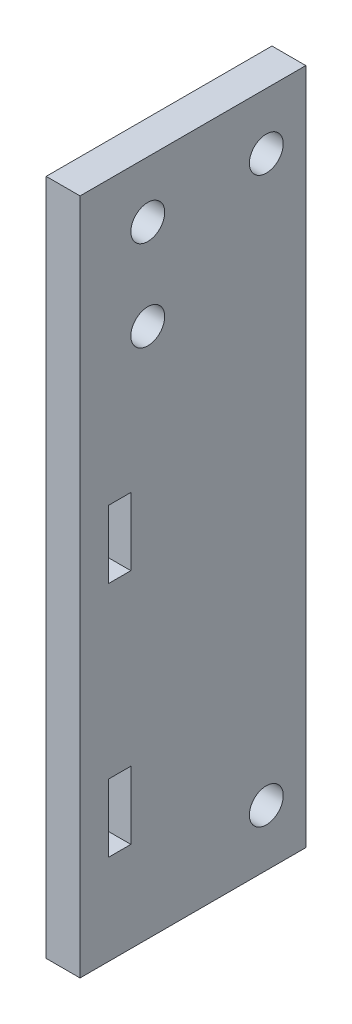
ISO-10303-21;
HEADER;
FILE_DESCRIPTION(('STEP AP214'),'2;1');
FILE_NAME('part.step','',(''),(''),'','','');
FILE_SCHEMA(('AUTOMOTIVE_DESIGN { 1 0 10303 214 1 1 1 1 }'));
ENDSEC;
DATA;
#1=APPLICATION_CONTEXT('core data for automotive mechanical design processes');
#2=APPLICATION_PROTOCOL_DEFINITION('international standard','automotive_design',2000,#1);
#3=PRODUCT_CONTEXT('',#1,'mechanical');
#4=PRODUCT('Part','Part','',(#3));
#5=PRODUCT_RELATED_PRODUCT_CATEGORY('part','',(#4));
#6=PRODUCT_DEFINITION_FORMATION('','',#4);
#7=PRODUCT_DEFINITION_CONTEXT('part definition',#1,'design');
#8=PRODUCT_DEFINITION('design','',#6,#7);
#9=PRODUCT_DEFINITION_SHAPE('','',#8);
#10=(LENGTH_UNIT() NAMED_UNIT(*) SI_UNIT(.MILLI.,.METRE.));
#11=(NAMED_UNIT(*) PLANE_ANGLE_UNIT() SI_UNIT($,.RADIAN.));
#12=(NAMED_UNIT(*) SI_UNIT($,.STERADIAN.) SOLID_ANGLE_UNIT());
#13=UNCERTAINTY_MEASURE_WITH_UNIT(LENGTH_MEASURE(1.E-05),#10,'distance_accuracy_value','');
#14=(GEOMETRIC_REPRESENTATION_CONTEXT(3) GLOBAL_UNCERTAINTY_ASSIGNED_CONTEXT((#13)) GLOBAL_UNIT_ASSIGNED_CONTEXT((#10,
#11,#12)) REPRESENTATION_CONTEXT('',''));
#15=CARTESIAN_POINT('',(0.,0.,0.));
#16=DIRECTION('',(0.,0.,1.));
#17=DIRECTION('',(1.,0.,0.));
#18=AXIS2_PLACEMENT_3D('',#15,#16,#17);
#19=CARTESIAN_POINT('',(0.,50.118347710839,69.8641041332545));
#20=DIRECTION('',(0.,1.,0.));
#21=DIRECTION('',(1.,0.,0.));
#22=AXIS2_PLACEMENT_3D('',#19,#20,#21);
#23=PLANE('',#22);
#24=DIRECTION('',(0.,0.,1.));
#25=VECTOR('',#24,1.);
#26=CARTESIAN_POINT('',(0.,50.118347710839,69.8641041332545));
#27=LINE('',#26,#25);
#28=CARTESIAN_POINT('',(0.,50.118347710839,69.8641041332545));
#29=VERTEX_POINT('',#28);
#30=CARTESIAN_POINT('',(0.,50.118347710839,89.8641041332545));
#31=VERTEX_POINT('',#30);
#32=EDGE_CURVE('E254',#29,#31,#27,.T.);
#33=ORIENTED_EDGE('',*,*,#32,.T.);
#34=DIRECTION('',(1.,0.,0.));
#35=VECTOR('',#34,1.);
#36=CARTESIAN_POINT('',(0.,50.118347710839,89.8641041332545));
#37=LINE('',#36,#35);
#38=CARTESIAN_POINT('',(3.,50.118347710839,89.8641041332545));
#39=VERTEX_POINT('',#38);
#40=EDGE_CURVE('E10',#31,#39,#37,.T.);
#41=ORIENTED_EDGE('',*,*,#40,.T.);
#42=DIRECTION('',(0.,0.,1.));
#43=VECTOR('',#42,1.);
#44=CARTESIAN_POINT('',(3.,50.118347710839,69.8641041332545));
#45=LINE('',#44,#43);
#46=CARTESIAN_POINT('',(3.,50.118347710839,69.8641041332545));
#47=VERTEX_POINT('',#46);
#48=EDGE_CURVE('E240',#47,#39,#45,.T.);
#49=ORIENTED_EDGE('',*,*,#48,.F.);
#50=DIRECTION('',(1.,0.,0.));
#51=VECTOR('',#50,1.);
#52=CARTESIAN_POINT('',(0.,50.118347710839,69.8641041332545));
#53=LINE('',#52,#51);
#54=EDGE_CURVE('E150',#29,#47,#53,.T.);
#55=ORIENTED_EDGE('',*,*,#54,.F.);
#56=EDGE_LOOP('',(#33,#41,#49,#55));
#57=FACE_BOUND('',#56,.T.);
#58=ADVANCED_FACE('F15',(#57),#23,.T.);
#59=CARTESIAN_POINT('',(0.,50.118347710839,89.8641041332545));
#60=DIRECTION('',(0.,0.,1.));
#61=DIRECTION('',(1.,0.,0.));
#62=AXIS2_PLACEMENT_3D('',#59,#60,#61);
#63=PLANE('',#62);
#64=DIRECTION('',(0.,-1.,0.));
#65=VECTOR('',#64,1.);
#66=CARTESIAN_POINT('',(0.,50.118347710839,89.8641041332545));
#67=LINE('',#66,#65);
#68=CARTESIAN_POINT('',(0.,-9.88165228916096,89.8641041332545));
#69=VERTEX_POINT('',#68);
#70=EDGE_CURVE('E259',#31,#69,#67,.T.);
#71=ORIENTED_EDGE('',*,*,#70,.T.);
#72=DIRECTION('',(1.,0.,0.));
#73=VECTOR('',#72,1.);
#74=CARTESIAN_POINT('',(0.,-9.88165228916096,89.8641041332545));
#75=LINE('',#74,#73);
#76=CARTESIAN_POINT('',(3.,-9.88165228916096,89.8641041332545));
#77=VERTEX_POINT('',#76);
#78=EDGE_CURVE('E26',#69,#77,#75,.T.);
#79=ORIENTED_EDGE('',*,*,#78,.T.);
#80=DIRECTION('',(0.,-1.,0.));
#81=VECTOR('',#80,1.);
#82=CARTESIAN_POINT('',(3.,50.118347710839,89.8641041332545));
#83=LINE('',#82,#81);
#84=EDGE_CURVE('E270',#39,#77,#83,.T.);
#85=ORIENTED_EDGE('',*,*,#84,.F.);
#86=ORIENTED_EDGE('',*,*,#40,.F.);
#87=EDGE_LOOP('',(#71,#79,#85,#86));
#88=FACE_BOUND('',#87,.T.);
#89=ADVANCED_FACE('F353',(#88),#63,.T.);
#90=CARTESIAN_POINT('',(0.,-9.88165228916096,89.8641041332545));
#91=DIRECTION('',(0.,-1.,0.));
#92=DIRECTION('',(0.,0.,-1.));
#93=AXIS2_PLACEMENT_3D('',#90,#91,#92);
#94=PLANE('',#93);
#95=DIRECTION('',(0.,0.,-1.));
#96=VECTOR('',#95,1.);
#97=CARTESIAN_POINT('',(0.,-9.88165228916096,89.8641041332545));
#98=LINE('',#97,#96);
#99=CARTESIAN_POINT('',(0.,-9.88165228916096,69.8641041332545));
#100=VERTEX_POINT('',#99);
#101=EDGE_CURVE('E237',#69,#100,#98,.T.);
#102=ORIENTED_EDGE('',*,*,#101,.T.);
#103=DIRECTION('',(1.,0.,0.));
#104=VECTOR('',#103,1.);
#105=CARTESIAN_POINT('',(0.,-9.88165228916096,69.8641041332545));
#106=LINE('',#105,#104);
#107=CARTESIAN_POINT('',(3.,-9.88165228916096,69.8641041332545));
#108=VERTEX_POINT('',#107);
#109=EDGE_CURVE('E172',#100,#108,#106,.T.);
#110=ORIENTED_EDGE('',*,*,#109,.T.);
#111=DIRECTION('',(0.,0.,-1.));
#112=VECTOR('',#111,1.);
#113=CARTESIAN_POINT('',(3.,-9.88165228916096,89.8641041332545));
#114=LINE('',#113,#112);
#115=EDGE_CURVE('E263',#77,#108,#114,.T.);
#116=ORIENTED_EDGE('',*,*,#115,.F.);
#117=ORIENTED_EDGE('',*,*,#78,.F.);
#118=EDGE_LOOP('',(#102,#110,#116,#117));
#119=FACE_BOUND('',#118,.T.);
#120=ADVANCED_FACE('F359',(#119),#94,.T.);
#121=CARTESIAN_POINT('',(0.,-9.88165228916096,69.8641041332545));
#122=DIRECTION('',(0.,0.,-1.));
#123=DIRECTION('',(0.,-1.,0.));
#124=AXIS2_PLACEMENT_3D('',#121,#122,#123);
#125=PLANE('',#124);
#126=DIRECTION('',(0.,1.,0.));
#127=VECTOR('',#126,1.);
#128=CARTESIAN_POINT('',(0.,-9.88165228916096,69.8641041332545));
#129=LINE('',#128,#127);
#130=EDGE_CURVE('E234',#100,#29,#129,.T.);
#131=ORIENTED_EDGE('',*,*,#130,.T.);
#132=ORIENTED_EDGE('',*,*,#54,.T.);
#133=DIRECTION('',(0.,1.,0.));
#134=VECTOR('',#133,1.);
#135=CARTESIAN_POINT('',(3.,-9.88165228916096,69.8641041332545));
#136=LINE('',#135,#134);
#137=EDGE_CURVE('E260',#108,#47,#136,.T.);
#138=ORIENTED_EDGE('',*,*,#137,.F.);
#139=ORIENTED_EDGE('',*,*,#109,.F.);
#140=EDGE_LOOP('',(#131,#132,#138,#139));
#141=FACE_BOUND('',#140,.T.);
#142=ADVANCED_FACE('F379',(#141),#125,.T.);
#143=CARTESIAN_POINT('',(0.,4.11834771083904,87.3641041332545));
#144=DIRECTION('',(0.,0.,1.));
#145=DIRECTION('',(1.,0.,0.));
#146=AXIS2_PLACEMENT_3D('',#143,#144,#145);
#147=PLANE('',#146);
#148=DIRECTION('',(0.,1.,0.));
#149=VECTOR('',#148,1.);
#150=CARTESIAN_POINT('',(3.,4.11834771083904,87.3641041332545));
#151=LINE('',#150,#149);
#152=CARTESIAN_POINT('',(3.,-1.88165228916096,87.3641041332545));
#153=VERTEX_POINT('',#152);
#154=CARTESIAN_POINT('',(3.,4.11834771083904,87.3641041332545));
#155=VERTEX_POINT('',#154);
#156=EDGE_CURVE('E19',#153,#155,#151,.T.);
#157=ORIENTED_EDGE('',*,*,#156,.F.);
#158=DIRECTION('',(1.,0.,0.));
#159=VECTOR('',#158,1.);
#160=CARTESIAN_POINT('',(0.,-1.88165228916096,87.3641041332545));
#161=LINE('',#160,#159);
#162=CARTESIAN_POINT('',(0.,-1.88165228916096,87.3641041332545));
#163=VERTEX_POINT('',#162);
#164=EDGE_CURVE('E86',#163,#153,#161,.T.);
#165=ORIENTED_EDGE('',*,*,#164,.F.);
#166=DIRECTION('',(0.,-1.,0.));
#167=VECTOR('',#166,1.);
#168=CARTESIAN_POINT('',(0.,4.11834771083904,87.3641041332545));
#169=LINE('',#168,#167);
#170=CARTESIAN_POINT('',(0.,4.11834771083904,87.3641041332545));
#171=VERTEX_POINT('',#170);
#172=EDGE_CURVE('E258',#171,#163,#169,.T.);
#173=ORIENTED_EDGE('',*,*,#172,.F.);
#174=DIRECTION('',(1.,0.,0.));
#175=VECTOR('',#174,1.);
#176=CARTESIAN_POINT('',(0.,4.11834771083904,87.3641041332545));
#177=LINE('',#176,#175);
#178=EDGE_CURVE('E299',#171,#155,#177,.T.);
#179=ORIENTED_EDGE('',*,*,#178,.T.);
#180=EDGE_LOOP('',(#157,#165,#173,#179));
#181=FACE_BOUND('',#180,.T.);
#182=ADVANCED_FACE('F374',(#181),#147,.F.);
#183=CARTESIAN_POINT('',(0.,-1.88165228916096,87.3641041332545));
#184=DIRECTION('',(0.,-1.,0.));
#185=DIRECTION('',(0.,0.,-1.));
#186=AXIS2_PLACEMENT_3D('',#183,#184,#185);
#187=PLANE('',#186);
#188=DIRECTION('',(0.,0.,1.));
#189=VECTOR('',#188,1.);
#190=CARTESIAN_POINT('',(3.,-1.88165228916096,87.3641041332545));
#191=LINE('',#190,#189);
#192=CARTESIAN_POINT('',(3.,-1.88165228916096,85.3641041332545));
#193=VERTEX_POINT('',#192);
#194=EDGE_CURVE('E323',#193,#153,#191,.T.);
#195=ORIENTED_EDGE('',*,*,#194,.F.);
#196=DIRECTION('',(1.,0.,0.));
#197=VECTOR('',#196,1.);
#198=CARTESIAN_POINT('',(0.,-1.88165228916096,85.3641041332545));
#199=LINE('',#198,#197);
#200=CARTESIAN_POINT('',(0.,-1.88165228916096,85.3641041332545));
#201=VERTEX_POINT('',#200);
#202=EDGE_CURVE('E70',#201,#193,#199,.T.);
#203=ORIENTED_EDGE('',*,*,#202,.F.);
#204=DIRECTION('',(0.,0.,-1.));
#205=VECTOR('',#204,1.);
#206=CARTESIAN_POINT('',(0.,-1.88165228916096,87.3641041332545));
#207=LINE('',#206,#205);
#208=EDGE_CURVE('E233',#163,#201,#207,.T.);
#209=ORIENTED_EDGE('',*,*,#208,.F.);
#210=ORIENTED_EDGE('',*,*,#164,.T.);
#211=EDGE_LOOP('',(#195,#203,#209,#210));
#212=FACE_BOUND('',#211,.T.);
#213=ADVANCED_FACE('F370',(#212),#187,.F.);
#214=CARTESIAN_POINT('',(0.,-1.88165228916096,85.3641041332545));
#215=DIRECTION('',(0.,0.,-1.));
#216=DIRECTION('',(0.,-1.,0.));
#217=AXIS2_PLACEMENT_3D('',#214,#215,#216);
#218=PLANE('',#217);
#219=DIRECTION('',(0.,-1.,0.));
#220=VECTOR('',#219,1.);
#221=CARTESIAN_POINT('',(3.,-1.88165228916096,85.3641041332545));
#222=LINE('',#221,#220);
#223=CARTESIAN_POINT('',(3.,4.11834771083904,85.3641041332545));
#224=VERTEX_POINT('',#223);
#225=EDGE_CURVE('E291',#224,#193,#222,.T.);
#226=ORIENTED_EDGE('',*,*,#225,.F.);
#227=DIRECTION('',(1.,0.,0.));
#228=VECTOR('',#227,1.);
#229=CARTESIAN_POINT('',(0.,4.11834771083904,85.3641041332545));
#230=LINE('',#229,#228);
#231=CARTESIAN_POINT('',(0.,4.11834771083904,85.3641041332545));
#232=VERTEX_POINT('',#231);
#233=EDGE_CURVE('E247',#232,#224,#230,.T.);
#234=ORIENTED_EDGE('',*,*,#233,.F.);
#235=DIRECTION('',(0.,1.,0.));
#236=VECTOR('',#235,1.);
#237=CARTESIAN_POINT('',(0.,-1.88165228916096,85.3641041332545));
#238=LINE('',#237,#236);
#239=EDGE_CURVE('E229',#201,#232,#238,.T.);
#240=ORIENTED_EDGE('',*,*,#239,.F.);
#241=ORIENTED_EDGE('',*,*,#202,.T.);
#242=EDGE_LOOP('',(#226,#234,#240,#241));
#243=FACE_BOUND('',#242,.T.);
#244=ADVANCED_FACE('F366',(#243),#218,.F.);
#245=CARTESIAN_POINT('',(0.,4.11834771083904,85.3641041332545));
#246=DIRECTION('',(0.,1.,0.));
#247=DIRECTION('',(1.,0.,0.));
#248=AXIS2_PLACEMENT_3D('',#245,#246,#247);
#249=PLANE('',#248);
#250=DIRECTION('',(0.,0.,-1.));
#251=VECTOR('',#250,1.);
#252=CARTESIAN_POINT('',(3.,4.11834771083904,85.3641041332545));
#253=LINE('',#252,#251);
#254=EDGE_CURVE('E287',#155,#224,#253,.T.);
#255=ORIENTED_EDGE('',*,*,#254,.F.);
#256=ORIENTED_EDGE('',*,*,#178,.F.);
#257=DIRECTION('',(0.,0.,1.));
#258=VECTOR('',#257,1.);
#259=CARTESIAN_POINT('',(0.,4.11834771083904,85.3641041332545));
#260=LINE('',#259,#258);
#261=EDGE_CURVE('E224',#232,#171,#260,.T.);
#262=ORIENTED_EDGE('',*,*,#261,.F.);
#263=ORIENTED_EDGE('',*,*,#233,.T.);
#264=EDGE_LOOP('',(#255,#256,#262,#263));
#265=FACE_BOUND('',#264,.T.);
#266=ADVANCED_FACE('F369',(#265),#249,.F.);
#267=CARTESIAN_POINT('',(0.,25.118347710839,87.3641041332545));
#268=DIRECTION('',(0.,0.,1.));
#269=DIRECTION('',(1.,0.,0.));
#270=AXIS2_PLACEMENT_3D('',#267,#268,#269);
#271=PLANE('',#270);
#272=DIRECTION('',(0.,1.,0.));
#273=VECTOR('',#272,1.);
#274=CARTESIAN_POINT('',(3.,25.118347710839,87.3641041332545));
#275=LINE('',#274,#273);
#276=CARTESIAN_POINT('',(3.,19.118347710839,87.3641041332545));
#277=VERTEX_POINT('',#276);
#278=CARTESIAN_POINT('',(3.,25.118347710839,87.3641041332545));
#279=VERTEX_POINT('',#278);
#280=EDGE_CURVE('E252',#277,#279,#275,.T.);
#281=ORIENTED_EDGE('',*,*,#280,.F.);
#282=DIRECTION('',(1.,0.,0.));
#283=VECTOR('',#282,1.);
#284=CARTESIAN_POINT('',(0.,19.118347710839,87.3641041332545));
#285=LINE('',#284,#283);
#286=CARTESIAN_POINT('',(0.,19.118347710839,87.3641041332545));
#287=VERTEX_POINT('',#286);
#288=EDGE_CURVE('E186',#287,#277,#285,.T.);
#289=ORIENTED_EDGE('',*,*,#288,.F.);
#290=DIRECTION('',(0.,-1.,0.));
#291=VECTOR('',#290,1.);
#292=CARTESIAN_POINT('',(0.,25.118347710839,87.3641041332545));
#293=LINE('',#292,#291);
#294=CARTESIAN_POINT('',(0.,25.118347710839,87.3641041332545));
#295=VERTEX_POINT('',#294);
#296=EDGE_CURVE('E217',#295,#287,#293,.T.);
#297=ORIENTED_EDGE('',*,*,#296,.F.);
#298=DIRECTION('',(1.,0.,0.));
#299=VECTOR('',#298,1.);
#300=CARTESIAN_POINT('',(0.,25.118347710839,87.3641041332545));
#301=LINE('',#300,#299);
#302=EDGE_CURVE('E244',#295,#279,#301,.T.);
#303=ORIENTED_EDGE('',*,*,#302,.T.);
#304=EDGE_LOOP('',(#281,#289,#297,#303));
#305=FACE_BOUND('',#304,.T.);
#306=ADVANCED_FACE('F382',(#305),#271,.F.);
#307=CARTESIAN_POINT('',(0.,19.118347710839,87.3641041332545));
#308=DIRECTION('',(0.,-1.,0.));
#309=DIRECTION('',(0.,0.,-1.));
#310=AXIS2_PLACEMENT_3D('',#307,#308,#309);
#311=PLANE('',#310);
#312=DIRECTION('',(0.,0.,1.));
#313=VECTOR('',#312,1.);
#314=CARTESIAN_POINT('',(3.,19.118347710839,87.3641041332545));
#315=LINE('',#314,#313);
#316=CARTESIAN_POINT('',(3.,19.118347710839,85.3641041332545));
#317=VERTEX_POINT('',#316);
#318=EDGE_CURVE('E199',#317,#277,#315,.T.);
#319=ORIENTED_EDGE('',*,*,#318,.F.);
#320=DIRECTION('',(1.,0.,0.));
#321=VECTOR('',#320,1.);
#322=CARTESIAN_POINT('',(0.,19.118347710839,85.3641041332545));
#323=LINE('',#322,#321);
#324=CARTESIAN_POINT('',(0.,19.118347710839,85.3641041332545));
#325=VERTEX_POINT('',#324);
#326=EDGE_CURVE('E192',#325,#317,#323,.T.);
#327=ORIENTED_EDGE('',*,*,#326,.F.);
#328=DIRECTION('',(0.,0.,-1.));
#329=VECTOR('',#328,1.);
#330=CARTESIAN_POINT('',(0.,19.118347710839,87.3641041332545));
#331=LINE('',#330,#329);
#332=EDGE_CURVE('E196',#287,#325,#331,.T.);
#333=ORIENTED_EDGE('',*,*,#332,.F.);
#334=ORIENTED_EDGE('',*,*,#288,.T.);
#335=EDGE_LOOP('',(#319,#327,#333,#334));
#336=FACE_BOUND('',#335,.T.);
#337=ADVANCED_FACE('F194',(#336),#311,.F.);
#338=CARTESIAN_POINT('',(0.,19.118347710839,85.3641041332545));
#339=DIRECTION('',(0.,0.,-1.));
#340=DIRECTION('',(0.,-1.,0.));
#341=AXIS2_PLACEMENT_3D('',#338,#339,#340);
#342=PLANE('',#341);
#343=DIRECTION('',(0.,-1.,0.));
#344=VECTOR('',#343,1.);
#345=CARTESIAN_POINT('',(3.,19.118347710839,85.3641041332545));
#346=LINE('',#345,#344);
#347=CARTESIAN_POINT('',(3.,25.118347710839,85.3641041332545));
#348=VERTEX_POINT('',#347);
#349=EDGE_CURVE('E251',#348,#317,#346,.T.);
#350=ORIENTED_EDGE('',*,*,#349,.F.);
#351=DIRECTION('',(1.,0.,0.));
#352=VECTOR('',#351,1.);
#353=CARTESIAN_POINT('',(0.,25.118347710839,85.3641041332545));
#354=LINE('',#353,#352);
#355=CARTESIAN_POINT('',(0.,25.118347710839,85.3641041332545));
#356=VERTEX_POINT('',#355);
#357=EDGE_CURVE('E204',#356,#348,#354,.T.);
#358=ORIENTED_EDGE('',*,*,#357,.F.);
#359=DIRECTION('',(0.,1.,0.));
#360=VECTOR('',#359,1.);
#361=CARTESIAN_POINT('',(0.,19.118347710839,85.3641041332545));
#362=LINE('',#361,#360);
#363=EDGE_CURVE('E207',#325,#356,#362,.T.);
#364=ORIENTED_EDGE('',*,*,#363,.F.);
#365=ORIENTED_EDGE('',*,*,#326,.T.);
#366=EDGE_LOOP('',(#350,#358,#364,#365));
#367=FACE_BOUND('',#366,.T.);
#368=ADVANCED_FACE('F208',(#367),#342,.F.);
#369=CARTESIAN_POINT('',(0.,25.118347710839,85.3641041332545));
#370=DIRECTION('',(0.,1.,0.));
#371=DIRECTION('',(0.,0.,-1.));
#372=AXIS2_PLACEMENT_3D('',#369,#370,#371);
#373=PLANE('',#372);
#374=DIRECTION('',(0.,0.,-1.));
#375=VECTOR('',#374,1.);
#376=CARTESIAN_POINT('',(3.,25.118347710839,85.3641041332545));
#377=LINE('',#376,#375);
#378=EDGE_CURVE('E248',#279,#348,#377,.T.);
#379=ORIENTED_EDGE('',*,*,#378,.F.);
#380=ORIENTED_EDGE('',*,*,#302,.F.);
#381=DIRECTION('',(0.,0.,1.));
#382=VECTOR('',#381,1.);
#383=CARTESIAN_POINT('',(0.,25.118347710839,85.3641041332545));
#384=LINE('',#383,#382);
#385=EDGE_CURVE('E213',#356,#295,#384,.T.);
#386=ORIENTED_EDGE('',*,*,#385,.F.);
#387=ORIENTED_EDGE('',*,*,#357,.T.);
#388=EDGE_LOOP('',(#379,#380,#386,#387));
#389=FACE_BOUND('',#388,.T.);
#390=ADVANCED_FACE('F364',(#389),#373,.F.);
#391=CARTESIAN_POINT('',(0.,-4.88165228916096,73.3641041332545));
#392=DIRECTION('',(1.,0.,0.));
#393=DIRECTION('',(0.,1.,0.));
#394=AXIS2_PLACEMENT_3D('',#391,#392,#393);
#395=CYLINDRICAL_SURFACE('',#394,1.5);
#396=CARTESIAN_POINT('',(3.,-4.88165228916096,73.3641041332545));
#397=DIRECTION('',(-1.,0.,0.));
#398=DIRECTION('',(0.,1.,0.));
#399=AXIS2_PLACEMENT_3D('',#396,#397,#398);
#400=CIRCLE('',#399,1.5);
#401=CARTESIAN_POINT('',(3.,-3.38165228916096,73.3641041332545));
#402=VERTEX_POINT('',#401);
#403=EDGE_CURVE('E296',#402,#402,#400,.T.);
#404=ORIENTED_EDGE('',*,*,#403,.F.);
#405=EDGE_LOOP('',(#404));
#406=FACE_BOUND('',#405,.T.);
#407=CARTESIAN_POINT('',(0.,-4.88165228916096,73.3641041332545));
#408=DIRECTION('',(1.,0.,0.));
#409=DIRECTION('',(0.,1.,0.));
#410=AXIS2_PLACEMENT_3D('',#407,#408,#409);
#411=CIRCLE('',#410,1.5);
#412=CARTESIAN_POINT('',(0.,-3.38165228916096,73.3641041332545));
#413=VERTEX_POINT('',#412);
#414=EDGE_CURVE('E276',#413,#413,#411,.T.);
#415=ORIENTED_EDGE('',*,*,#414,.F.);
#416=EDGE_LOOP('',(#415));
#417=FACE_BOUND('',#416,.T.);
#418=ADVANCED_FACE('F348',(#406,#417),#395,.F.);
#419=CARTESIAN_POINT('',(0.,37.118347710839,83.8641041332545));
#420=DIRECTION('',(1.,0.,0.));
#421=DIRECTION('',(0.,1.,0.));
#422=AXIS2_PLACEMENT_3D('',#419,#420,#421);
#423=CYLINDRICAL_SURFACE('',#422,1.5);
#424=CARTESIAN_POINT('',(3.,37.118347710839,83.8641041332545));
#425=DIRECTION('',(-1.,0.,0.));
#426=DIRECTION('',(0.,1.,0.));
#427=AXIS2_PLACEMENT_3D('',#424,#425,#426);
#428=CIRCLE('',#427,1.5);
#429=CARTESIAN_POINT('',(3.,38.618347710839,83.8641041332545));
#430=VERTEX_POINT('',#429);
#431=EDGE_CURVE('E292',#430,#430,#428,.T.);
#432=ORIENTED_EDGE('',*,*,#431,.F.);
#433=EDGE_LOOP('',(#432));
#434=FACE_BOUND('',#433,.T.);
#435=CARTESIAN_POINT('',(0.,37.118347710839,83.8641041332545));
#436=DIRECTION('',(1.,0.,0.));
#437=DIRECTION('',(0.,1.,0.));
#438=AXIS2_PLACEMENT_3D('',#435,#436,#437);
#439=CIRCLE('',#438,1.5);
#440=CARTESIAN_POINT('',(0.,38.618347710839,83.8641041332545));
#441=VERTEX_POINT('',#440);
#442=EDGE_CURVE('E273',#441,#441,#439,.T.);
#443=ORIENTED_EDGE('',*,*,#442,.F.);
#444=EDGE_LOOP('',(#443));
#445=FACE_BOUND('',#444,.T.);
#446=ADVANCED_FACE('F17',(#434,#445),#423,.F.);
#447=CARTESIAN_POINT('',(0.,45.118347710839,83.8641041332545));
#448=DIRECTION('',(1.,0.,0.));
#449=DIRECTION('',(0.,1.,0.));
#450=AXIS2_PLACEMENT_3D('',#447,#448,#449);
#451=CYLINDRICAL_SURFACE('',#450,1.5);
#452=CARTESIAN_POINT('',(3.,45.118347710839,83.8641041332545));
#453=DIRECTION('',(-1.,0.,0.));
#454=DIRECTION('',(0.,1.,0.));
#455=AXIS2_PLACEMENT_3D('',#452,#453,#454);
#456=CIRCLE('',#455,1.5);
#457=CARTESIAN_POINT('',(3.,46.618347710839,83.8641041332545));
#458=VERTEX_POINT('',#457);
#459=EDGE_CURVE('E295',#458,#458,#456,.T.);
#460=ORIENTED_EDGE('',*,*,#459,.F.);
#461=EDGE_LOOP('',(#460));
#462=FACE_BOUND('',#461,.T.);
#463=CARTESIAN_POINT('',(0.,45.118347710839,83.8641041332545));
#464=DIRECTION('',(1.,0.,0.));
#465=DIRECTION('',(0.,1.,0.));
#466=AXIS2_PLACEMENT_3D('',#463,#464,#465);
#467=CIRCLE('',#466,1.5);
#468=CARTESIAN_POINT('',(0.,46.618347710839,83.8641041332545));
#469=VERTEX_POINT('',#468);
#470=EDGE_CURVE('E241',#469,#469,#467,.T.);
#471=ORIENTED_EDGE('',*,*,#470,.F.);
#472=EDGE_LOOP('',(#471));
#473=FACE_BOUND('',#472,.T.);
#474=ADVANCED_FACE('F336',(#462,#473),#451,.F.);
#475=CARTESIAN_POINT('',(0.,45.118347710839,73.3641041332545));
#476=DIRECTION('',(1.,0.,0.));
#477=DIRECTION('',(0.,1.,0.));
#478=AXIS2_PLACEMENT_3D('',#475,#476,#477);
#479=CYLINDRICAL_SURFACE('',#478,1.5);
#480=CARTESIAN_POINT('',(3.,45.118347710839,73.3641041332545));
#481=DIRECTION('',(-1.,0.,0.));
#482=DIRECTION('',(0.,1.,0.));
#483=AXIS2_PLACEMENT_3D('',#480,#481,#482);
#484=CIRCLE('',#483,1.5);
#485=CARTESIAN_POINT('',(3.,46.618347710839,73.3641041332545));
#486=VERTEX_POINT('',#485);
#487=EDGE_CURVE('E38',#486,#486,#484,.T.);
#488=ORIENTED_EDGE('',*,*,#487,.F.);
#489=EDGE_LOOP('',(#488));
#490=FACE_BOUND('',#489,.T.);
#491=CARTESIAN_POINT('',(0.,45.118347710839,73.3641041332545));
#492=DIRECTION('',(1.,0.,0.));
#493=DIRECTION('',(0.,1.,0.));
#494=AXIS2_PLACEMENT_3D('',#491,#492,#493);
#495=CIRCLE('',#494,1.5);
#496=CARTESIAN_POINT('',(0.,46.618347710839,73.3641041332545));
#497=VERTEX_POINT('',#496);
#498=EDGE_CURVE('E139',#497,#497,#495,.T.);
#499=ORIENTED_EDGE('',*,*,#498,.F.);
#500=EDGE_LOOP('',(#499));
#501=FACE_BOUND('',#500,.T.);
#502=ADVANCED_FACE('F338',(#490,#501),#479,.F.);
#503=CARTESIAN_POINT('',(3.,0.,0.));
#504=DIRECTION('',(1.,0.,0.));
#505=DIRECTION('',(0.,0.,-1.));
#506=AXIS2_PLACEMENT_3D('',#503,#504,#505);
#507=PLANE('',#506);
#508=ORIENTED_EDGE('',*,*,#487,.T.);
#509=EDGE_LOOP('',(#508));
#510=FACE_BOUND('',#509,.T.);
#511=ORIENTED_EDGE('',*,*,#459,.T.);
#512=EDGE_LOOP('',(#511));
#513=FACE_BOUND('',#512,.T.);
#514=ORIENTED_EDGE('',*,*,#431,.T.);
#515=EDGE_LOOP('',(#514));
#516=FACE_BOUND('',#515,.T.);
#517=ORIENTED_EDGE('',*,*,#403,.T.);
#518=EDGE_LOOP('',(#517));
#519=FACE_BOUND('',#518,.T.);
#520=ORIENTED_EDGE('',*,*,#280,.T.);
#521=ORIENTED_EDGE('',*,*,#378,.T.);
#522=ORIENTED_EDGE('',*,*,#349,.T.);
#523=ORIENTED_EDGE('',*,*,#318,.T.);
#524=EDGE_LOOP('',(#520,#521,#522,#523));
#525=FACE_BOUND('',#524,.T.);
#526=ORIENTED_EDGE('',*,*,#156,.T.);
#527=ORIENTED_EDGE('',*,*,#254,.T.);
#528=ORIENTED_EDGE('',*,*,#225,.T.);
#529=ORIENTED_EDGE('',*,*,#194,.T.);
#530=EDGE_LOOP('',(#526,#527,#528,#529));
#531=FACE_BOUND('',#530,.T.);
#532=ORIENTED_EDGE('',*,*,#48,.T.);
#533=ORIENTED_EDGE('',*,*,#84,.T.);
#534=ORIENTED_EDGE('',*,*,#115,.T.);
#535=ORIENTED_EDGE('',*,*,#137,.T.);
#536=EDGE_LOOP('',(#532,#533,#534,#535));
#537=FACE_BOUND('',#536,.T.);
#538=ADVANCED_FACE('F345',(#510,#513,#516,#519,#525,#531,#537),#507,.T.);
#539=CARTESIAN_POINT('',(0.,0.,0.));
#540=DIRECTION('',(1.,0.,0.));
#541=DIRECTION('',(0.,0.,-1.));
#542=AXIS2_PLACEMENT_3D('',#539,#540,#541);
#543=PLANE('',#542);
#544=ORIENTED_EDGE('',*,*,#498,.T.);
#545=EDGE_LOOP('',(#544));
#546=FACE_BOUND('',#545,.T.);
#547=ORIENTED_EDGE('',*,*,#470,.T.);
#548=EDGE_LOOP('',(#547));
#549=FACE_BOUND('',#548,.T.);
#550=ORIENTED_EDGE('',*,*,#442,.T.);
#551=EDGE_LOOP('',(#550));
#552=FACE_BOUND('',#551,.T.);
#553=ORIENTED_EDGE('',*,*,#414,.T.);
#554=EDGE_LOOP('',(#553));
#555=FACE_BOUND('',#554,.T.);
#556=ORIENTED_EDGE('',*,*,#296,.T.);
#557=ORIENTED_EDGE('',*,*,#332,.T.);
#558=ORIENTED_EDGE('',*,*,#363,.T.);
#559=ORIENTED_EDGE('',*,*,#385,.T.);
#560=EDGE_LOOP('',(#556,#557,#558,#559));
#561=FACE_BOUND('',#560,.T.);
#562=ORIENTED_EDGE('',*,*,#172,.T.);
#563=ORIENTED_EDGE('',*,*,#208,.T.);
#564=ORIENTED_EDGE('',*,*,#239,.T.);
#565=ORIENTED_EDGE('',*,*,#261,.T.);
#566=EDGE_LOOP('',(#562,#563,#564,#565));
#567=FACE_BOUND('',#566,.T.);
#568=ORIENTED_EDGE('',*,*,#130,.F.);
#569=ORIENTED_EDGE('',*,*,#101,.F.);
#570=ORIENTED_EDGE('',*,*,#70,.F.);
#571=ORIENTED_EDGE('',*,*,#32,.F.);
#572=EDGE_LOOP('',(#568,#569,#570,#571));
#573=FACE_BOUND('',#572,.T.);
#574=ADVANCED_FACE('F215',(#546,#549,#552,#555,#561,#567,#573),#543,.F.);
#575=CLOSED_SHELL('',(#58,#89,#120,#142,#182,#213,#244,#266,#306,#337,#368,#390,#418,#446,#474,
#502,#538,#574));
#576=MANIFOLD_SOLID_BREP('B1',#575);
#577=ADVANCED_BREP_SHAPE_REPRESENTATION('',(#18,#576),#14);
#578=SHAPE_DEFINITION_REPRESENTATION(#9,#577);
ENDSEC;
END-ISO-10303-21;
